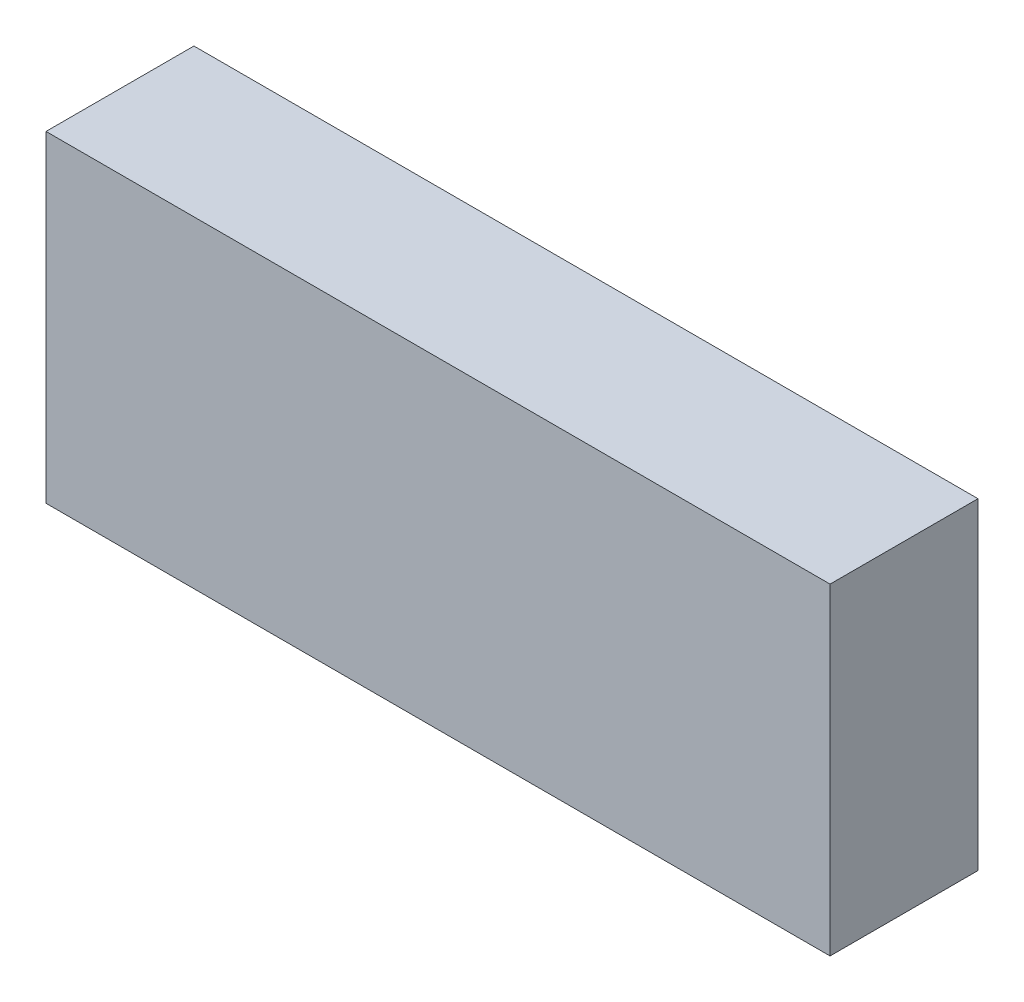
ISO-10303-21;
HEADER;
FILE_DESCRIPTION(('STEP AP214'),'2;1');
FILE_NAME('part.step','',(''),(''),'','','');
FILE_SCHEMA(('AUTOMOTIVE_DESIGN { 1 0 10303 214 1 1 1 1 }'));
ENDSEC;
DATA;
#1=APPLICATION_CONTEXT('core data for automotive mechanical design processes');
#2=APPLICATION_PROTOCOL_DEFINITION('international standard','automotive_design',2000,#1);
#3=PRODUCT_CONTEXT('',#1,'mechanical');
#4=PRODUCT('Part','Part','',(#3));
#5=PRODUCT_RELATED_PRODUCT_CATEGORY('part','',(#4));
#6=PRODUCT_DEFINITION_FORMATION('','',#4);
#7=PRODUCT_DEFINITION_CONTEXT('part definition',#1,'design');
#8=PRODUCT_DEFINITION('design','',#6,#7);
#9=PRODUCT_DEFINITION_SHAPE('','',#8);
#10=(LENGTH_UNIT() NAMED_UNIT(*) SI_UNIT(.MILLI.,.METRE.));
#11=(NAMED_UNIT(*) PLANE_ANGLE_UNIT() SI_UNIT($,.RADIAN.));
#12=(NAMED_UNIT(*) SI_UNIT($,.STERADIAN.) SOLID_ANGLE_UNIT());
#13=UNCERTAINTY_MEASURE_WITH_UNIT(LENGTH_MEASURE(1.E-05),#10,'distance_accuracy_value','');
#14=(GEOMETRIC_REPRESENTATION_CONTEXT(3) GLOBAL_UNCERTAINTY_ASSIGNED_CONTEXT((#13)) GLOBAL_UNIT_ASSIGNED_CONTEXT((#10,
#11,#12)) REPRESENTATION_CONTEXT('',''));
#15=CARTESIAN_POINT('',(0.,0.,0.));
#16=DIRECTION('',(0.,0.,1.));
#17=DIRECTION('',(1.,0.,0.));
#18=AXIS2_PLACEMENT_3D('',#15,#16,#17);
#19=CARTESIAN_POINT('',(-2.65,1.127,1.));
#20=DIRECTION('',(0.,0.,1.));
#21=DIRECTION('',(1.,0.,0.));
#22=AXIS2_PLACEMENT_3D('',#19,#20,#21);
#23=PLANE('',#22);
#24=DIRECTION('',(0.,1.,0.));
#25=VECTOR('',#24,1.);
#26=CARTESIAN_POINT('',(2.65,1.127,1.));
#27=LINE('',#26,#25);
#28=CARTESIAN_POINT('',(2.65,1.127,1.));
#29=VERTEX_POINT('',#28);
#30=CARTESIAN_POINT('',(2.65,-1.05,1.));
#31=VERTEX_POINT('',#30);
#32=EDGE_CURVE('E53',#29,#31,#27,.F.);
#33=ORIENTED_EDGE('',*,*,#32,.F.);
#34=DIRECTION('',(1.,0.,0.));
#35=VECTOR('',#34,1.);
#36=CARTESIAN_POINT('',(-2.65,1.127,1.));
#37=LINE('',#36,#35);
#38=CARTESIAN_POINT('',(-2.65,1.127,1.));
#39=VERTEX_POINT('',#38);
#40=EDGE_CURVE('E68',#39,#29,#37,.T.);
#41=ORIENTED_EDGE('',*,*,#40,.F.);
#42=DIRECTION('',(0.,1.,0.));
#43=VECTOR('',#42,1.);
#44=CARTESIAN_POINT('',(-2.65,-1.05,1.));
#45=LINE('',#44,#43);
#46=CARTESIAN_POINT('',(-2.65,-1.05,1.));
#47=VERTEX_POINT('',#46);
#48=EDGE_CURVE('E20',#47,#39,#45,.T.);
#49=ORIENTED_EDGE('',*,*,#48,.F.);
#50=DIRECTION('',(1.,0.,0.));
#51=VECTOR('',#50,1.);
#52=CARTESIAN_POINT('',(2.65,-1.05,1.));
#53=LINE('',#52,#51);
#54=EDGE_CURVE('E58',#31,#47,#53,.F.);
#55=ORIENTED_EDGE('',*,*,#54,.F.);
#56=EDGE_LOOP('',(#33,#41,#49,#55));
#57=FACE_BOUND('',#56,.T.);
#58=ADVANCED_FACE('F17',(#57),#23,.T.);
#59=CARTESIAN_POINT('',(-2.65,-1.05,0.));
#60=DIRECTION('',(-1.,0.,0.));
#61=DIRECTION('',(0.,0.,1.));
#62=AXIS2_PLACEMENT_3D('',#59,#60,#61);
#63=PLANE('',#62);
#64=DIRECTION('',(0.,0.,1.));
#65=VECTOR('',#64,1.);
#66=CARTESIAN_POINT('',(-2.65,1.127,0.));
#67=LINE('',#66,#65);
#68=CARTESIAN_POINT('',(-2.65,1.127,0.));
#69=VERTEX_POINT('',#68);
#70=EDGE_CURVE('E79',#69,#39,#67,.T.);
#71=ORIENTED_EDGE('',*,*,#70,.F.);
#72=DIRECTION('',(0.,1.,0.));
#73=VECTOR('',#72,1.);
#74=CARTESIAN_POINT('',(-2.65,1.127,0.));
#75=LINE('',#74,#73);
#76=CARTESIAN_POINT('',(-2.65,-1.05,0.));
#77=VERTEX_POINT('',#76);
#78=EDGE_CURVE('E74',#69,#77,#75,.F.);
#79=ORIENTED_EDGE('',*,*,#78,.T.);
#80=DIRECTION('',(0.,0.,-1.));
#81=VECTOR('',#80,1.);
#82=CARTESIAN_POINT('',(-2.65,-1.05,0.));
#83=LINE('',#82,#81);
#84=EDGE_CURVE('E63',#47,#77,#83,.T.);
#85=ORIENTED_EDGE('',*,*,#84,.F.);
#86=ORIENTED_EDGE('',*,*,#48,.T.);
#87=EDGE_LOOP('',(#71,#79,#85,#86));
#88=FACE_BOUND('',#87,.T.);
#89=ADVANCED_FACE('F73',(#88),#63,.T.);
#90=CARTESIAN_POINT('',(2.65,-1.05,0.));
#91=DIRECTION('',(0.,-1.,0.));
#92=DIRECTION('',(0.,0.,-1.));
#93=AXIS2_PLACEMENT_3D('',#90,#91,#92);
#94=PLANE('',#93);
#95=ORIENTED_EDGE('',*,*,#84,.T.);
#96=DIRECTION('',(1.,0.,0.));
#97=VECTOR('',#96,1.);
#98=CARTESIAN_POINT('',(-2.65,-1.05,0.));
#99=LINE('',#98,#97);
#100=CARTESIAN_POINT('',(2.65,-1.05,0.));
#101=VERTEX_POINT('',#100);
#102=EDGE_CURVE('E84',#77,#101,#99,.T.);
#103=ORIENTED_EDGE('',*,*,#102,.T.);
#104=DIRECTION('',(0.,0.,-1.));
#105=VECTOR('',#104,1.);
#106=CARTESIAN_POINT('',(2.65,-1.05,0.));
#107=LINE('',#106,#105);
#108=EDGE_CURVE('E65',#31,#101,#107,.T.);
#109=ORIENTED_EDGE('',*,*,#108,.F.);
#110=ORIENTED_EDGE('',*,*,#54,.T.);
#111=EDGE_LOOP('',(#95,#103,#109,#110));
#112=FACE_BOUND('',#111,.T.);
#113=ADVANCED_FACE('F60',(#112),#94,.T.);
#114=CARTESIAN_POINT('',(2.65,1.127,0.));
#115=DIRECTION('',(1.,0.,0.));
#116=DIRECTION('',(0.,0.,-1.));
#117=AXIS2_PLACEMENT_3D('',#114,#115,#116);
#118=PLANE('',#117);
#119=ORIENTED_EDGE('',*,*,#108,.T.);
#120=DIRECTION('',(0.,1.,0.));
#121=VECTOR('',#120,1.);
#122=CARTESIAN_POINT('',(2.65,1.127,0.));
#123=LINE('',#122,#121);
#124=CARTESIAN_POINT('',(2.65,1.127,0.));
#125=VERTEX_POINT('',#124);
#126=EDGE_CURVE('E26',#101,#125,#123,.T.);
#127=ORIENTED_EDGE('',*,*,#126,.T.);
#128=DIRECTION('',(0.,0.,1.));
#129=VECTOR('',#128,1.);
#130=CARTESIAN_POINT('',(2.65,1.127,0.));
#131=LINE('',#130,#129);
#132=EDGE_CURVE('E34',#29,#125,#131,.F.);
#133=ORIENTED_EDGE('',*,*,#132,.F.);
#134=ORIENTED_EDGE('',*,*,#32,.T.);
#135=EDGE_LOOP('',(#119,#127,#133,#134));
#136=FACE_BOUND('',#135,.T.);
#137=ADVANCED_FACE('F88',(#136),#118,.T.);
#138=CARTESIAN_POINT('',(-2.65,1.127,0.));
#139=DIRECTION('',(0.,1.,0.));
#140=DIRECTION('',(0.,0.,1.));
#141=AXIS2_PLACEMENT_3D('',#138,#139,#140);
#142=PLANE('',#141);
#143=ORIENTED_EDGE('',*,*,#132,.T.);
#144=DIRECTION('',(1.,0.,0.));
#145=VECTOR('',#144,1.);
#146=CARTESIAN_POINT('',(-2.65,1.127,0.));
#147=LINE('',#146,#145);
#148=EDGE_CURVE('E11',#125,#69,#147,.F.);
#149=ORIENTED_EDGE('',*,*,#148,.T.);
#150=ORIENTED_EDGE('',*,*,#70,.T.);
#151=ORIENTED_EDGE('',*,*,#40,.T.);
#152=EDGE_LOOP('',(#143,#149,#150,#151));
#153=FACE_BOUND('',#152,.T.);
#154=ADVANCED_FACE('F91',(#153),#142,.T.);
#155=CARTESIAN_POINT('',(-2.65,1.127,0.));
#156=DIRECTION('',(0.,0.,1.));
#157=DIRECTION('',(1.,0.,0.));
#158=AXIS2_PLACEMENT_3D('',#155,#156,#157);
#159=PLANE('',#158);
#160=ORIENTED_EDGE('',*,*,#126,.F.);
#161=ORIENTED_EDGE('',*,*,#102,.F.);
#162=ORIENTED_EDGE('',*,*,#78,.F.);
#163=ORIENTED_EDGE('',*,*,#148,.F.);
#164=EDGE_LOOP('',(#160,#161,#162,#163));
#165=FACE_BOUND('',#164,.T.);
#166=ADVANCED_FACE('F90',(#165),#159,.F.);
#167=CLOSED_SHELL('',(#58,#89,#113,#137,#154,#166));
#168=MANIFOLD_SOLID_BREP('B1',#167);
#169=ADVANCED_BREP_SHAPE_REPRESENTATION('',(#18,#168),#14);
#170=SHAPE_DEFINITION_REPRESENTATION(#9,#169);
ENDSEC;
END-ISO-10303-21;
